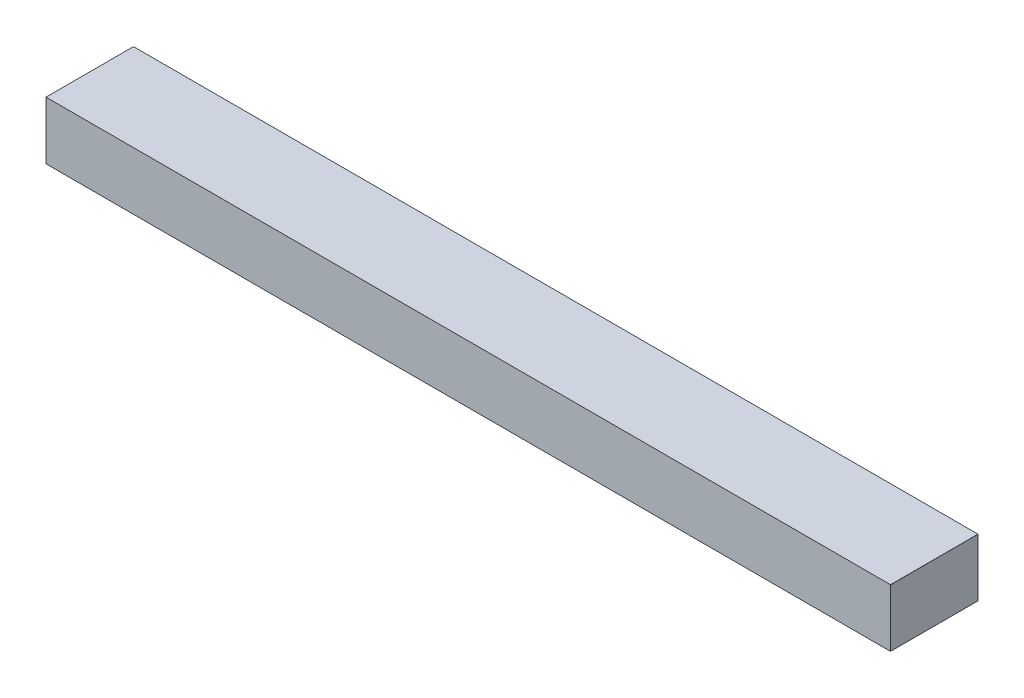
ISO-10303-21;
HEADER;
FILE_DESCRIPTION(('STEP AP214'),'2;1');
FILE_NAME('part.step','',(''),(''),'','','');
FILE_SCHEMA(('AUTOMOTIVE_DESIGN { 1 0 10303 214 1 1 1 1 }'));
ENDSEC;
DATA;
#1=APPLICATION_CONTEXT('core data for automotive mechanical design processes');
#2=APPLICATION_PROTOCOL_DEFINITION('international standard','automotive_design',2000,#1);
#3=PRODUCT_CONTEXT('',#1,'mechanical');
#4=PRODUCT('Part','Part','',(#3));
#5=PRODUCT_RELATED_PRODUCT_CATEGORY('part','',(#4));
#6=PRODUCT_DEFINITION_FORMATION('','',#4);
#7=PRODUCT_DEFINITION_CONTEXT('part definition',#1,'design');
#8=PRODUCT_DEFINITION('design','',#6,#7);
#9=PRODUCT_DEFINITION_SHAPE('','',#8);
#10=(LENGTH_UNIT() NAMED_UNIT(*) SI_UNIT(.MILLI.,.METRE.));
#11=(NAMED_UNIT(*) PLANE_ANGLE_UNIT() SI_UNIT($,.RADIAN.));
#12=(NAMED_UNIT(*) SI_UNIT($,.STERADIAN.) SOLID_ANGLE_UNIT());
#13=UNCERTAINTY_MEASURE_WITH_UNIT(LENGTH_MEASURE(1.E-05),#10,'distance_accuracy_value','');
#14=(GEOMETRIC_REPRESENTATION_CONTEXT(3) GLOBAL_UNCERTAINTY_ASSIGNED_CONTEXT((#13)) GLOBAL_UNIT_ASSIGNED_CONTEXT((#10,
#11,#12)) REPRESENTATION_CONTEXT('',''));
#15=CARTESIAN_POINT('',(0.,0.,0.));
#16=DIRECTION('',(0.,0.,1.));
#17=DIRECTION('',(1.,0.,0.));
#18=AXIS2_PLACEMENT_3D('',#15,#16,#17);
#19=CARTESIAN_POINT('',(12.065,-0.82499962,0.));
#20=DIRECTION('',(-1.,0.,0.));
#21=DIRECTION('',(0.,0.,1.));
#22=AXIS2_PLACEMENT_3D('',#19,#20,#21);
#23=PLANE('',#22);
#24=DIRECTION('',(0.,1.,0.));
#25=VECTOR('',#24,1.);
#26=CARTESIAN_POINT('',(12.065,-0.82499962,0.));
#27=LINE('',#26,#25);
#28=CARTESIAN_POINT('',(12.065,-0.82499962,0.));
#29=VERTEX_POINT('',#28);
#30=CARTESIAN_POINT('',(12.065,0.82367882,0.));
#31=VERTEX_POINT('',#30);
#32=EDGE_CURVE('E11',#29,#31,#27,.T.);
#33=ORIENTED_EDGE('',*,*,#32,.T.);
#34=DIRECTION('',(0.,0.,1.));
#35=VECTOR('',#34,1.);
#36=CARTESIAN_POINT('',(12.065,0.82367882,0.));
#37=LINE('',#36,#35);
#38=CARTESIAN_POINT('',(12.065,0.82367882,2.50000008));
#39=VERTEX_POINT('',#38);
#40=EDGE_CURVE('E28',#31,#39,#37,.T.);
#41=ORIENTED_EDGE('',*,*,#40,.T.);
#42=DIRECTION('',(0.,1.,0.));
#43=VECTOR('',#42,1.);
#44=CARTESIAN_POINT('',(12.065,-0.82499962,2.50000008));
#45=LINE('',#44,#43);
#46=CARTESIAN_POINT('',(12.065,-0.82499962,2.50000008));
#47=VERTEX_POINT('',#46);
#48=EDGE_CURVE('E110',#47,#39,#45,.T.);
#49=ORIENTED_EDGE('',*,*,#48,.F.);
#50=DIRECTION('',(0.,0.,1.));
#51=VECTOR('',#50,1.);
#52=CARTESIAN_POINT('',(12.065,-0.82499962,0.));
#53=LINE('',#52,#51);
#54=EDGE_CURVE('E106',#29,#47,#53,.T.);
#55=ORIENTED_EDGE('',*,*,#54,.F.);
#56=EDGE_LOOP('',(#33,#41,#49,#55));
#57=FACE_BOUND('',#56,.T.);
#58=ADVANCED_FACE('F17',(#57),#23,.F.);
#59=CARTESIAN_POINT('',(12.065,0.82367882,0.));
#60=DIRECTION('',(-0.707106781186548,-0.707106781186548,0.));
#61=DIRECTION('',(-0.707106781186548,0.707106781186548,0.));
#62=AXIS2_PLACEMENT_3D('',#59,#60,#61);
#63=PLANE('',#62);
#64=DIRECTION('',(-0.707106781186548,0.707106781186548,0.));
#65=VECTOR('',#64,1.);
#66=CARTESIAN_POINT('',(12.065,0.82367882,0.));
#67=LINE('',#66,#65);
#68=CARTESIAN_POINT('',(12.0636792,0.82499962,0.));
#69=VERTEX_POINT('',#68);
#70=EDGE_CURVE('E111',#31,#69,#67,.T.);
#71=ORIENTED_EDGE('',*,*,#70,.T.);
#72=DIRECTION('',(0.,0.,1.));
#73=VECTOR('',#72,1.);
#74=CARTESIAN_POINT('',(12.0636792,0.82499962,0.));
#75=LINE('',#74,#73);
#76=CARTESIAN_POINT('',(12.0636792,0.82499962,2.50000008));
#77=VERTEX_POINT('',#76);
#78=EDGE_CURVE('E91',#69,#77,#75,.T.);
#79=ORIENTED_EDGE('',*,*,#78,.T.);
#80=DIRECTION('',(-0.707106781186548,0.707106781186548,0.));
#81=VECTOR('',#80,1.);
#82=CARTESIAN_POINT('',(12.065,0.82367882,2.50000008));
#83=LINE('',#82,#81);
#84=EDGE_CURVE('E120',#39,#77,#83,.T.);
#85=ORIENTED_EDGE('',*,*,#84,.F.);
#86=ORIENTED_EDGE('',*,*,#40,.F.);
#87=EDGE_LOOP('',(#71,#79,#85,#86));
#88=FACE_BOUND('',#87,.T.);
#89=ADVANCED_FACE('F137',(#88),#63,.F.);
#90=CARTESIAN_POINT('',(12.0636792,0.82499962,0.));
#91=DIRECTION('',(0.,-1.,0.));
#92=DIRECTION('',(0.,0.,-1.));
#93=AXIS2_PLACEMENT_3D('',#90,#91,#92);
#94=PLANE('',#93);
#95=DIRECTION('',(-1.,0.,0.));
#96=VECTOR('',#95,1.);
#97=CARTESIAN_POINT('',(12.0636792,0.82499962,0.));
#98=LINE('',#97,#96);
#99=CARTESIAN_POINT('',(-12.065,0.82499962,0.));
#100=VERTEX_POINT('',#99);
#101=EDGE_CURVE('E87',#69,#100,#98,.T.);
#102=ORIENTED_EDGE('',*,*,#101,.T.);
#103=DIRECTION('',(0.,0.,1.));
#104=VECTOR('',#103,1.);
#105=CARTESIAN_POINT('',(-12.065,0.82499962,0.));
#106=LINE('',#105,#104);
#107=CARTESIAN_POINT('',(-12.065,0.82499962,2.50000008));
#108=VERTEX_POINT('',#107);
#109=EDGE_CURVE('E21',#100,#108,#106,.T.);
#110=ORIENTED_EDGE('',*,*,#109,.T.);
#111=DIRECTION('',(-1.,0.,0.));
#112=VECTOR('',#111,1.);
#113=CARTESIAN_POINT('',(12.0636792,0.82499962,2.50000008));
#114=LINE('',#113,#112);
#115=EDGE_CURVE('E116',#77,#108,#114,.T.);
#116=ORIENTED_EDGE('',*,*,#115,.F.);
#117=ORIENTED_EDGE('',*,*,#78,.F.);
#118=EDGE_LOOP('',(#102,#110,#116,#117));
#119=FACE_BOUND('',#118,.T.);
#120=ADVANCED_FACE('F89',(#119),#94,.F.);
#121=CARTESIAN_POINT('',(-12.065,0.82499962,0.));
#122=DIRECTION('',(1.,0.,0.));
#123=DIRECTION('',(0.,1.,0.));
#124=AXIS2_PLACEMENT_3D('',#121,#122,#123);
#125=PLANE('',#124);
#126=DIRECTION('',(0.,-1.,0.));
#127=VECTOR('',#126,1.);
#128=CARTESIAN_POINT('',(-12.065,0.82499962,0.));
#129=LINE('',#128,#127);
#130=CARTESIAN_POINT('',(-12.065,-0.82499962,0.));
#131=VERTEX_POINT('',#130);
#132=EDGE_CURVE('E81',#100,#131,#129,.T.);
#133=ORIENTED_EDGE('',*,*,#132,.T.);
#134=DIRECTION('',(0.,0.,1.));
#135=VECTOR('',#134,1.);
#136=CARTESIAN_POINT('',(-12.065,-0.82499962,0.));
#137=LINE('',#136,#135);
#138=CARTESIAN_POINT('',(-12.065,-0.82499962,2.50000008));
#139=VERTEX_POINT('',#138);
#140=EDGE_CURVE('E101',#131,#139,#137,.T.);
#141=ORIENTED_EDGE('',*,*,#140,.T.);
#142=DIRECTION('',(0.,-1.,0.));
#143=VECTOR('',#142,1.);
#144=CARTESIAN_POINT('',(-12.065,0.82499962,2.50000008));
#145=LINE('',#144,#143);
#146=EDGE_CURVE('E83',#108,#139,#145,.T.);
#147=ORIENTED_EDGE('',*,*,#146,.F.);
#148=ORIENTED_EDGE('',*,*,#109,.F.);
#149=EDGE_LOOP('',(#133,#141,#147,#148));
#150=FACE_BOUND('',#149,.T.);
#151=ADVANCED_FACE('F78',(#150),#125,.F.);
#152=CARTESIAN_POINT('',(-12.065,-0.82499962,0.));
#153=DIRECTION('',(0.,1.,0.));
#154=DIRECTION('',(1.,0.,0.));
#155=AXIS2_PLACEMENT_3D('',#152,#153,#154);
#156=PLANE('',#155);
#157=DIRECTION('',(1.,0.,0.));
#158=VECTOR('',#157,1.);
#159=CARTESIAN_POINT('',(-12.065,-0.82499962,0.));
#160=LINE('',#159,#158);
#161=EDGE_CURVE('E99',#131,#29,#160,.T.);
#162=ORIENTED_EDGE('',*,*,#161,.T.);
#163=ORIENTED_EDGE('',*,*,#54,.T.);
#164=DIRECTION('',(1.,0.,0.));
#165=VECTOR('',#164,1.);
#166=CARTESIAN_POINT('',(-12.065,-0.82499962,2.50000008));
#167=LINE('',#166,#165);
#168=EDGE_CURVE('E117',#139,#47,#167,.T.);
#169=ORIENTED_EDGE('',*,*,#168,.F.);
#170=ORIENTED_EDGE('',*,*,#140,.F.);
#171=EDGE_LOOP('',(#162,#163,#169,#170));
#172=FACE_BOUND('',#171,.T.);
#173=ADVANCED_FACE('F140',(#172),#156,.F.);
#174=CARTESIAN_POINT('',(12.065,-0.82499962,0.));
#175=DIRECTION('',(0.,0.,-1.));
#176=DIRECTION('',(0.,-1.,0.));
#177=AXIS2_PLACEMENT_3D('',#174,#175,#176);
#178=PLANE('',#177);
#179=ORIENTED_EDGE('',*,*,#161,.F.);
#180=ORIENTED_EDGE('',*,*,#132,.F.);
#181=ORIENTED_EDGE('',*,*,#101,.F.);
#182=ORIENTED_EDGE('',*,*,#70,.F.);
#183=ORIENTED_EDGE('',*,*,#32,.F.);
#184=EDGE_LOOP('',(#179,#180,#181,#182,#183));
#185=FACE_BOUND('',#184,.T.);
#186=ADVANCED_FACE('F96',(#185),#178,.T.);
#187=CARTESIAN_POINT('',(12.065,-0.82499962,2.50000008));
#188=DIRECTION('',(0.,0.,-1.));
#189=DIRECTION('',(0.,-1.,0.));
#190=AXIS2_PLACEMENT_3D('',#187,#188,#189);
#191=PLANE('',#190);
#192=ORIENTED_EDGE('',*,*,#48,.T.);
#193=ORIENTED_EDGE('',*,*,#84,.T.);
#194=ORIENTED_EDGE('',*,*,#115,.T.);
#195=ORIENTED_EDGE('',*,*,#146,.T.);
#196=ORIENTED_EDGE('',*,*,#168,.T.);
#197=EDGE_LOOP('',(#192,#193,#194,#195,#196));
#198=FACE_BOUND('',#197,.T.);
#199=ADVANCED_FACE('F19',(#198),#191,.F.);
#200=CLOSED_SHELL('',(#58,#89,#120,#151,#173,#186,#199));
#201=MANIFOLD_SOLID_BREP('B1',#200);
#202=ADVANCED_BREP_SHAPE_REPRESENTATION('',(#18,#201),#14);
#203=SHAPE_DEFINITION_REPRESENTATION(#9,#202);
ENDSEC;
END-ISO-10303-21;
